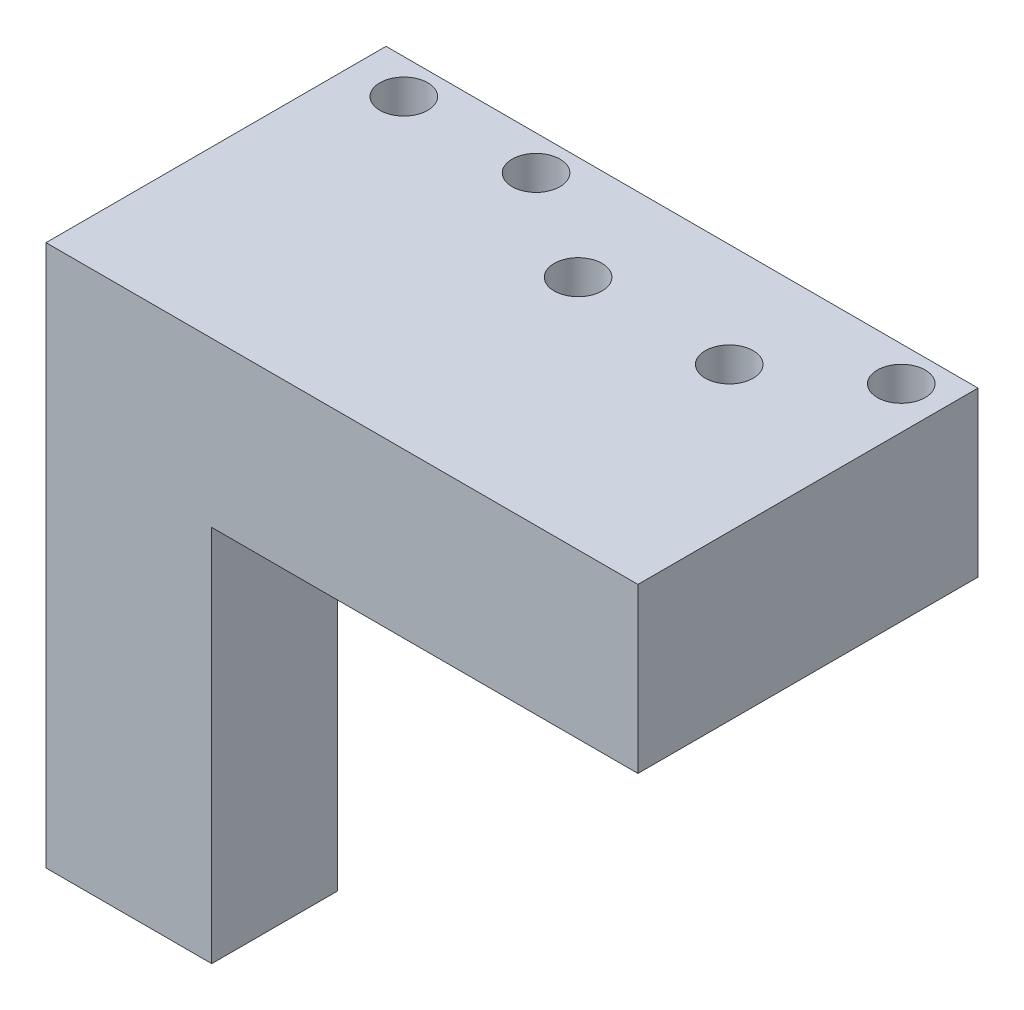
ISO-10303-21;
HEADER;
FILE_DESCRIPTION(('STEP AP214'),'2;1');
FILE_NAME('part.step','',(''),(''),'','','');
FILE_SCHEMA(('AUTOMOTIVE_DESIGN { 1 0 10303 214 1 1 1 1 }'));
ENDSEC;
DATA;
#1=APPLICATION_CONTEXT('core data for automotive mechanical design processes');
#2=APPLICATION_PROTOCOL_DEFINITION('international standard','automotive_design',2000,#1);
#3=PRODUCT_CONTEXT('',#1,'mechanical');
#4=PRODUCT('Part','Part','',(#3));
#5=PRODUCT_RELATED_PRODUCT_CATEGORY('part','',(#4));
#6=PRODUCT_DEFINITION_FORMATION('','',#4);
#7=PRODUCT_DEFINITION_CONTEXT('part definition',#1,'design');
#8=PRODUCT_DEFINITION('design','',#6,#7);
#9=PRODUCT_DEFINITION_SHAPE('','',#8);
#10=(LENGTH_UNIT() NAMED_UNIT(*) SI_UNIT(.MILLI.,.METRE.));
#11=(NAMED_UNIT(*) PLANE_ANGLE_UNIT() SI_UNIT($,.RADIAN.));
#12=(NAMED_UNIT(*) SI_UNIT($,.STERADIAN.) SOLID_ANGLE_UNIT());
#13=UNCERTAINTY_MEASURE_WITH_UNIT(LENGTH_MEASURE(1.E-05),#10,'distance_accuracy_value','');
#14=(GEOMETRIC_REPRESENTATION_CONTEXT(3) GLOBAL_UNCERTAINTY_ASSIGNED_CONTEXT((#13)) GLOBAL_UNIT_ASSIGNED_CONTEXT((#10,
#11,#12)) REPRESENTATION_CONTEXT('',''));
#15=CARTESIAN_POINT('',(0.,0.,0.));
#16=DIRECTION('',(0.,0.,1.));
#17=DIRECTION('',(1.,0.,0.));
#18=AXIS2_PLACEMENT_3D('',#15,#16,#17);
#19=CARTESIAN_POINT('',(0.,13.,0.));
#20=DIRECTION('',(0.,-1.,0.));
#21=DIRECTION('',(0.,0.,-1.));
#22=AXIS2_PLACEMENT_3D('',#19,#20,#21);
#23=PLANE('',#22);
#24=DIRECTION('',(0.,0.,-1.));
#25=VECTOR('',#24,1.);
#26=CARTESIAN_POINT('',(23.5,13.,21.5));
#27=LINE('',#26,#25);
#28=CARTESIAN_POINT('',(23.5,13.,21.5));
#29=VERTEX_POINT('',#28);
#30=CARTESIAN_POINT('',(23.5,13.,-5.5));
#31=VERTEX_POINT('',#30);
#32=EDGE_CURVE('E93',#29,#31,#27,.T.);
#33=ORIENTED_EDGE('',*,*,#32,.T.);
#34=DIRECTION('',(-1.,0.,0.));
#35=VECTOR('',#34,1.);
#36=CARTESIAN_POINT('',(-23.5,13.,-5.5));
#37=LINE('',#36,#35);
#38=CARTESIAN_POINT('',(-23.5,13.,-5.5));
#39=VERTEX_POINT('',#38);
#40=EDGE_CURVE('E196',#31,#39,#37,.T.);
#41=ORIENTED_EDGE('',*,*,#40,.T.);
#42=DIRECTION('',(0.,0.,1.));
#43=VECTOR('',#42,1.);
#44=CARTESIAN_POINT('',(-23.5,13.,-5.5));
#45=LINE('',#44,#43);
#46=CARTESIAN_POINT('',(-23.5,13.,21.5));
#47=VERTEX_POINT('',#46);
#48=EDGE_CURVE('E199',#39,#47,#45,.T.);
#49=ORIENTED_EDGE('',*,*,#48,.T.);
#50=DIRECTION('',(1.,0.,0.));
#51=VECTOR('',#50,1.);
#52=CARTESIAN_POINT('',(-23.5,13.,21.5));
#53=LINE('',#52,#51);
#54=EDGE_CURVE('E70',#47,#29,#53,.T.);
#55=ORIENTED_EDGE('',*,*,#54,.T.);
#56=EDGE_LOOP('',(#33,#41,#49,#55));
#57=FACE_BOUND('',#56,.T.);
#58=CARTESIAN_POINT('',(20.1592426173726,13.,-2.75000000000001));
#59=DIRECTION('',(0.,1.,0.));
#60=DIRECTION('',(0.,0.,1.));
#61=AXIS2_PLACEMENT_3D('',#58,#59,#60);
#62=CIRCLE('',#61,1.9);
#63=CARTESIAN_POINT('',(20.1592426173726,13.,-4.65000000000001));
#64=VERTEX_POINT('',#63);
#65=EDGE_CURVE('E186',#64,#64,#62,.T.);
#66=ORIENTED_EDGE('',*,*,#65,.F.);
#67=EDGE_LOOP('',(#66));
#68=FACE_BOUND('',#67,.T.);
#69=CARTESIAN_POINT('',(-8.84075738262738,13.,-2.75000000000001));
#70=DIRECTION('',(0.,1.,0.));
#71=DIRECTION('',(0.,0.,1.));
#72=AXIS2_PLACEMENT_3D('',#69,#70,#71);
#73=CIRCLE('',#72,1.9);
#74=CARTESIAN_POINT('',(-8.84075738262738,13.,-4.65000000000001));
#75=VERTEX_POINT('',#74);
#76=EDGE_CURVE('E178',#75,#75,#73,.T.);
#77=ORIENTED_EDGE('',*,*,#76,.F.);
#78=EDGE_LOOP('',(#77));
#79=FACE_BOUND('',#78,.T.);
#80=CARTESIAN_POINT('',(-19.3407573826274,13.,-2.75000000000001));
#81=DIRECTION('',(0.,1.,0.));
#82=DIRECTION('',(0.,0.,1.));
#83=AXIS2_PLACEMENT_3D('',#80,#81,#82);
#84=CIRCLE('',#83,1.9);
#85=CARTESIAN_POINT('',(-19.3407573826274,13.,-4.65000000000001));
#86=VERTEX_POINT('',#85);
#87=EDGE_CURVE('E171',#86,#86,#84,.T.);
#88=ORIENTED_EDGE('',*,*,#87,.F.);
#89=EDGE_LOOP('',(#88));
#90=FACE_BOUND('',#89,.T.);
#91=CARTESIAN_POINT('',(0.,13.,2.75));
#92=DIRECTION('',(0.,1.,0.));
#93=DIRECTION('',(0.,0.,1.));
#94=AXIS2_PLACEMENT_3D('',#91,#92,#93);
#95=CIRCLE('',#94,1.9);
#96=CARTESIAN_POINT('',(0.,13.,0.85));
#97=VERTEX_POINT('',#96);
#98=EDGE_CURVE('E163',#97,#97,#95,.T.);
#99=ORIENTED_EDGE('',*,*,#98,.F.);
#100=EDGE_LOOP('',(#99));
#101=FACE_BOUND('',#100,.T.);
#102=CARTESIAN_POINT('',(12.,13.,2.75));
#103=DIRECTION('',(0.,1.,0.));
#104=DIRECTION('',(0.,0.,1.));
#105=AXIS2_PLACEMENT_3D('',#102,#103,#104);
#106=CIRCLE('',#105,1.9);
#107=CARTESIAN_POINT('',(12.,13.,0.85));
#108=VERTEX_POINT('',#107);
#109=EDGE_CURVE('E155',#108,#108,#106,.T.);
#110=ORIENTED_EDGE('',*,*,#109,.F.);
#111=EDGE_LOOP('',(#110));
#112=FACE_BOUND('',#111,.T.);
#113=ADVANCED_FACE('F45',(#57,#68,#79,#90,#101,#112),#23,.F.);
#114=CARTESIAN_POINT('',(0.,0.,0.));
#115=DIRECTION('',(0.,-1.,0.));
#116=DIRECTION('',(0.,0.,-1.));
#117=AXIS2_PLACEMENT_3D('',#114,#115,#116);
#118=PLANE('',#117);
#119=DIRECTION('',(0.,0.,1.));
#120=VECTOR('',#119,1.);
#121=CARTESIAN_POINT('',(-10.3407573826274,0.,11.5));
#122=LINE('',#121,#120);
#123=CARTESIAN_POINT('',(-10.3407573826274,0.,11.5));
#124=VERTEX_POINT('',#123);
#125=CARTESIAN_POINT('',(-10.3407573826274,0.,21.5));
#126=VERTEX_POINT('',#125);
#127=EDGE_CURVE('E149',#124,#126,#122,.T.);
#128=ORIENTED_EDGE('',*,*,#127,.F.);
#129=DIRECTION('',(-1.,0.,0.));
#130=VECTOR('',#129,1.);
#131=CARTESIAN_POINT('',(-23.5,0.,11.5));
#132=LINE('',#131,#130);
#133=CARTESIAN_POINT('',(-23.5,0.,11.5));
#134=VERTEX_POINT('',#133);
#135=EDGE_CURVE('E136',#124,#134,#132,.T.);
#136=ORIENTED_EDGE('',*,*,#135,.T.);
#137=DIRECTION('',(0.,0.,1.));
#138=VECTOR('',#137,1.);
#139=CARTESIAN_POINT('',(-23.5,0.,5.5));
#140=LINE('',#139,#138);
#141=CARTESIAN_POINT('',(-23.5,0.,-5.5));
#142=VERTEX_POINT('',#141);
#143=EDGE_CURVE('E134',#142,#134,#140,.T.);
#144=ORIENTED_EDGE('',*,*,#143,.F.);
#145=DIRECTION('',(-1.,0.,0.));
#146=VECTOR('',#145,1.);
#147=CARTESIAN_POINT('',(-23.5,0.,-5.5));
#148=LINE('',#147,#146);
#149=CARTESIAN_POINT('',(23.5,0.,-5.5));
#150=VERTEX_POINT('',#149);
#151=EDGE_CURVE('E207',#150,#142,#148,.T.);
#152=ORIENTED_EDGE('',*,*,#151,.F.);
#153=DIRECTION('',(0.,0.,-1.));
#154=VECTOR('',#153,1.);
#155=CARTESIAN_POINT('',(23.5,0.,-5.5));
#156=LINE('',#155,#154);
#157=CARTESIAN_POINT('',(23.5,0.,21.5));
#158=VERTEX_POINT('',#157);
#159=EDGE_CURVE('E190',#158,#150,#156,.T.);
#160=ORIENTED_EDGE('',*,*,#159,.F.);
#161=DIRECTION('',(1.,0.,0.));
#162=VECTOR('',#161,1.);
#163=CARTESIAN_POINT('',(-23.5,0.,21.5));
#164=LINE('',#163,#162);
#165=EDGE_CURVE('E88',#126,#158,#164,.T.);
#166=ORIENTED_EDGE('',*,*,#165,.F.);
#167=EDGE_LOOP('',(#128,#136,#144,#152,#160,#166));
#168=FACE_BOUND('',#167,.T.);
#169=CARTESIAN_POINT('',(0.,0.,2.75));
#170=DIRECTION('',(0.,1.,0.));
#171=DIRECTION('',(0.,0.,1.));
#172=AXIS2_PLACEMENT_3D('',#169,#170,#171);
#173=CIRCLE('',#172,1.9);
#174=CARTESIAN_POINT('',(0.,0.,0.85));
#175=VERTEX_POINT('',#174);
#176=EDGE_CURVE('E159',#175,#175,#173,.T.);
#177=ORIENTED_EDGE('',*,*,#176,.T.);
#178=EDGE_LOOP('',(#177));
#179=FACE_BOUND('',#178,.T.);
#180=CARTESIAN_POINT('',(-8.84075738262738,0.,-2.75000000000001));
#181=DIRECTION('',(0.,1.,0.));
#182=DIRECTION('',(0.,0.,1.));
#183=AXIS2_PLACEMENT_3D('',#180,#181,#182);
#184=CIRCLE('',#183,1.9);
#185=CARTESIAN_POINT('',(-8.84075738262738,0.,-4.65000000000001));
#186=VERTEX_POINT('',#185);
#187=EDGE_CURVE('E175',#186,#186,#184,.T.);
#188=ORIENTED_EDGE('',*,*,#187,.T.);
#189=EDGE_LOOP('',(#188));
#190=FACE_BOUND('',#189,.T.);
#191=CARTESIAN_POINT('',(20.1592426173726,0.,-2.75000000000001));
#192=DIRECTION('',(0.,1.,0.));
#193=DIRECTION('',(0.,0.,1.));
#194=AXIS2_PLACEMENT_3D('',#191,#192,#193);
#195=CIRCLE('',#194,1.9);
#196=CARTESIAN_POINT('',(20.1592426173726,0.,-4.65000000000001));
#197=VERTEX_POINT('',#196);
#198=EDGE_CURVE('E182',#197,#197,#195,.T.);
#199=ORIENTED_EDGE('',*,*,#198,.T.);
#200=EDGE_LOOP('',(#199));
#201=FACE_BOUND('',#200,.T.);
#202=CARTESIAN_POINT('',(-19.3407573826274,0.,-2.75000000000001));
#203=DIRECTION('',(0.,1.,0.));
#204=DIRECTION('',(0.,0.,1.));
#205=AXIS2_PLACEMENT_3D('',#202,#203,#204);
#206=CIRCLE('',#205,1.9);
#207=CARTESIAN_POINT('',(-19.3407573826274,0.,-4.65000000000001));
#208=VERTEX_POINT('',#207);
#209=EDGE_CURVE('E167',#208,#208,#206,.T.);
#210=ORIENTED_EDGE('',*,*,#209,.T.);
#211=EDGE_LOOP('',(#210));
#212=FACE_BOUND('',#211,.T.);
#213=CARTESIAN_POINT('',(12.,0.,2.75));
#214=DIRECTION('',(0.,1.,0.));
#215=DIRECTION('',(0.,0.,1.));
#216=AXIS2_PLACEMENT_3D('',#213,#214,#215);
#217=CIRCLE('',#216,1.9);
#218=CARTESIAN_POINT('',(12.,0.,0.85));
#219=VERTEX_POINT('',#218);
#220=EDGE_CURVE('E152',#219,#219,#217,.T.);
#221=ORIENTED_EDGE('',*,*,#220,.T.);
#222=EDGE_LOOP('',(#221));
#223=FACE_BOUND('',#222,.T.);
#224=ADVANCED_FACE('F229',(#168,#179,#190,#201,#212,#223),#118,.T.);
#225=CARTESIAN_POINT('',(23.5,13.,-5.5));
#226=DIRECTION('',(-1.,0.,0.));
#227=DIRECTION('',(0.,0.,1.));
#228=AXIS2_PLACEMENT_3D('',#225,#226,#227);
#229=PLANE('',#228);
#230=ORIENTED_EDGE('',*,*,#159,.T.);
#231=DIRECTION('',(0.,-1.,0.));
#232=VECTOR('',#231,1.);
#233=CARTESIAN_POINT('',(23.5,13.,-5.5));
#234=LINE('',#233,#232);
#235=EDGE_CURVE('E11',#31,#150,#234,.T.);
#236=ORIENTED_EDGE('',*,*,#235,.F.);
#237=ORIENTED_EDGE('',*,*,#32,.F.);
#238=DIRECTION('',(0.,-1.,0.));
#239=VECTOR('',#238,1.);
#240=CARTESIAN_POINT('',(23.5,13.,21.5));
#241=LINE('',#240,#239);
#242=EDGE_CURVE('E204',#29,#158,#241,.T.);
#243=ORIENTED_EDGE('',*,*,#242,.T.);
#244=EDGE_LOOP('',(#230,#236,#237,#243));
#245=FACE_BOUND('',#244,.T.);
#246=ADVANCED_FACE('F47',(#245),#229,.F.);
#247=CARTESIAN_POINT('',(-23.5,13.,-5.5));
#248=DIRECTION('',(0.,0.,1.));
#249=DIRECTION('',(1.,0.,0.));
#250=AXIS2_PLACEMENT_3D('',#247,#248,#249);
#251=PLANE('',#250);
#252=ORIENTED_EDGE('',*,*,#151,.T.);
#253=DIRECTION('',(0.,-1.,0.));
#254=VECTOR('',#253,1.);
#255=CARTESIAN_POINT('',(-23.5,13.,-5.5));
#256=LINE('',#255,#254);
#257=EDGE_CURVE('E54',#39,#142,#256,.T.);
#258=ORIENTED_EDGE('',*,*,#257,.F.);
#259=ORIENTED_EDGE('',*,*,#40,.F.);
#260=ORIENTED_EDGE('',*,*,#235,.T.);
#261=EDGE_LOOP('',(#252,#258,#259,#260));
#262=FACE_BOUND('',#261,.T.);
#263=ADVANCED_FACE('F225',(#262),#251,.F.);
#264=CARTESIAN_POINT('',(-23.5,13.,5.5));
#265=DIRECTION('',(1.,0.,0.));
#266=DIRECTION('',(0.,0.,-1.));
#267=AXIS2_PLACEMENT_3D('',#264,#265,#266);
#268=PLANE('',#267);
#269=ORIENTED_EDGE('',*,*,#143,.T.);
#270=DIRECTION('',(0.,-1.,0.));
#271=VECTOR('',#270,1.);
#272=CARTESIAN_POINT('',(-23.5,0.,11.5));
#273=LINE('',#272,#271);
#274=CARTESIAN_POINT('',(-23.5,-30.,11.5));
#275=VERTEX_POINT('',#274);
#276=EDGE_CURVE('E61',#134,#275,#273,.T.);
#277=ORIENTED_EDGE('',*,*,#276,.T.);
#278=DIRECTION('',(0.,0.,1.));
#279=VECTOR('',#278,1.);
#280=CARTESIAN_POINT('',(-23.5,-30.,11.5));
#281=LINE('',#280,#279);
#282=CARTESIAN_POINT('',(-23.5,-30.,21.5));
#283=VERTEX_POINT('',#282);
#284=EDGE_CURVE('E115',#275,#283,#281,.T.);
#285=ORIENTED_EDGE('',*,*,#284,.T.);
#286=DIRECTION('',(0.,-1.,0.));
#287=VECTOR('',#286,1.);
#288=CARTESIAN_POINT('',(-23.5,13.,21.5));
#289=LINE('',#288,#287);
#290=EDGE_CURVE('E218',#47,#283,#289,.T.);
#291=ORIENTED_EDGE('',*,*,#290,.F.);
#292=ORIENTED_EDGE('',*,*,#48,.F.);
#293=ORIENTED_EDGE('',*,*,#257,.T.);
#294=EDGE_LOOP('',(#269,#277,#285,#291,#292,#293));
#295=FACE_BOUND('',#294,.T.);
#296=ADVANCED_FACE('F132',(#295),#268,.F.);
#297=CARTESIAN_POINT('',(-23.5,13.,21.5));
#298=DIRECTION('',(0.,0.,-1.));
#299=DIRECTION('',(-1.,0.,0.));
#300=AXIS2_PLACEMENT_3D('',#297,#298,#299);
#301=PLANE('',#300);
#302=ORIENTED_EDGE('',*,*,#290,.T.);
#303=DIRECTION('',(1.,0.,0.));
#304=VECTOR('',#303,1.);
#305=CARTESIAN_POINT('',(-23.5,-30.,21.5));
#306=LINE('',#305,#304);
#307=CARTESIAN_POINT('',(-10.3407573826274,-30.,21.5));
#308=VERTEX_POINT('',#307);
#309=EDGE_CURVE('E120',#283,#308,#306,.T.);
#310=ORIENTED_EDGE('',*,*,#309,.T.);
#311=DIRECTION('',(0.,1.,0.));
#312=VECTOR('',#311,1.);
#313=CARTESIAN_POINT('',(-10.3407573826274,0.,21.5));
#314=LINE('',#313,#312);
#315=EDGE_CURVE('E141',#308,#126,#314,.T.);
#316=ORIENTED_EDGE('',*,*,#315,.T.);
#317=ORIENTED_EDGE('',*,*,#165,.T.);
#318=ORIENTED_EDGE('',*,*,#242,.F.);
#319=ORIENTED_EDGE('',*,*,#54,.F.);
#320=EDGE_LOOP('',(#302,#310,#316,#317,#318,#319));
#321=FACE_BOUND('',#320,.T.);
#322=ADVANCED_FACE('F234',(#321),#301,.F.);
#323=CARTESIAN_POINT('',(20.1592426173726,13.,-2.75000000000001));
#324=DIRECTION('',(0.,-1.,0.));
#325=DIRECTION('',(0.,0.,-1.));
#326=AXIS2_PLACEMENT_3D('',#323,#324,#325);
#327=CYLINDRICAL_SURFACE('',#326,1.9);
#328=CARTESIAN_POINT('',(20.1592426173726,13.,-4.65000000000001));
#329=CARTESIAN_POINT('',(20.1592426173726,12.8645833333333,-4.65000000000001));
#330=CARTESIAN_POINT('',(20.1592426173726,12.7291666666667,-4.65000000000001));
#331=CARTESIAN_POINT('',(20.1592426173726,12.4583333333333,-4.65000000000001));
#332=CARTESIAN_POINT('',(20.1592426173726,12.3229166666667,-4.65000000000001));
#333=CARTESIAN_POINT('',(20.1592426173726,12.0520833333333,-4.65000000000001));
#334=CARTESIAN_POINT('',(20.1592426173726,11.9166666666667,-4.65000000000001));
#335=CARTESIAN_POINT('',(20.1592426173726,11.6458333333333,-4.65000000000001));
#336=CARTESIAN_POINT('',(20.1592426173726,11.5104166666667,-4.65000000000001));
#337=CARTESIAN_POINT('',(20.1592426173726,11.2395833333333,-4.65000000000001));
#338=CARTESIAN_POINT('',(20.1592426173726,11.1041666666667,-4.65000000000001));
#339=CARTESIAN_POINT('',(20.1592426173726,10.8333333333333,-4.65000000000001));
#340=CARTESIAN_POINT('',(20.1592426173726,10.6979166666667,-4.65000000000001));
#341=CARTESIAN_POINT('',(20.1592426173726,10.4270833333333,-4.65000000000001));
#342=CARTESIAN_POINT('',(20.1592426173726,10.2916666666667,-4.65000000000001));
#343=CARTESIAN_POINT('',(20.1592426173726,10.0208333333333,-4.65000000000001));
#344=CARTESIAN_POINT('',(20.1592426173726,9.88541666666667,-4.65000000000001));
#345=CARTESIAN_POINT('',(20.1592426173726,9.61458333333333,-4.65000000000001));
#346=CARTESIAN_POINT('',(20.1592426173726,9.47916666666667,-4.65000000000001));
#347=CARTESIAN_POINT('',(20.1592426173726,9.20833333333333,-4.65000000000001));
#348=CARTESIAN_POINT('',(20.1592426173726,9.07291666666666,-4.65000000000001));
#349=CARTESIAN_POINT('',(20.1592426173726,8.80208333333333,-4.65000000000001));
#350=CARTESIAN_POINT('',(20.1592426173726,8.66666666666667,-4.65000000000001));
#351=CARTESIAN_POINT('',(20.1592426173726,8.39583333333333,-4.65000000000001));
#352=CARTESIAN_POINT('',(20.1592426173726,8.26041666666667,-4.65000000000001));
#353=CARTESIAN_POINT('',(20.1592426173726,7.98958333333333,-4.65000000000001));
#354=CARTESIAN_POINT('',(20.1592426173726,7.85416666666667,-4.65000000000001));
#355=CARTESIAN_POINT('',(20.1592426173726,7.58333333333333,-4.65000000000001));
#356=CARTESIAN_POINT('',(20.1592426173726,7.44791666666667,-4.65000000000001));
#357=CARTESIAN_POINT('',(20.1592426173726,7.17708333333333,-4.65000000000001));
#358=CARTESIAN_POINT('',(20.1592426173726,7.04166666666667,-4.65000000000001));
#359=CARTESIAN_POINT('',(20.1592426173726,6.77083333333333,-4.65000000000001));
#360=CARTESIAN_POINT('',(20.1592426173726,6.63541666666667,-4.65000000000001));
#361=CARTESIAN_POINT('',(20.1592426173726,6.36458333333333,-4.65000000000001));
#362=CARTESIAN_POINT('',(20.1592426173726,6.22916666666667,-4.65000000000001));
#363=CARTESIAN_POINT('',(20.1592426173726,5.95833333333333,-4.65000000000001));
#364=CARTESIAN_POINT('',(20.1592426173726,5.82291666666667,-4.65000000000001));
#365=CARTESIAN_POINT('',(20.1592426173726,5.55208333333333,-4.65000000000001));
#366=CARTESIAN_POINT('',(20.1592426173726,5.41666666666667,-4.65000000000001));
#367=CARTESIAN_POINT('',(20.1592426173726,5.14583333333333,-4.65000000000001));
#368=CARTESIAN_POINT('',(20.1592426173726,5.01041666666667,-4.65000000000001));
#369=CARTESIAN_POINT('',(20.1592426173726,4.73958333333333,-4.65000000000001));
#370=CARTESIAN_POINT('',(20.1592426173726,4.60416666666667,-4.65000000000001));
#371=CARTESIAN_POINT('',(20.1592426173726,4.33333333333333,-4.65000000000001));
#372=CARTESIAN_POINT('',(20.1592426173726,4.19791666666667,-4.65000000000001));
#373=CARTESIAN_POINT('',(20.1592426173726,3.92708333333333,-4.65000000000001));
#374=CARTESIAN_POINT('',(20.1592426173726,3.79166666666667,-4.65000000000001));
#375=CARTESIAN_POINT('',(20.1592426173726,3.52083333333333,-4.65000000000001));
#376=CARTESIAN_POINT('',(20.1592426173726,3.38541666666667,-4.65000000000001));
#377=CARTESIAN_POINT('',(20.1592426173726,3.11458333333333,-4.65000000000001));
#378=CARTESIAN_POINT('',(20.1592426173726,2.97916666666667,-4.65000000000001));
#379=CARTESIAN_POINT('',(20.1592426173726,2.70833333333333,-4.65000000000001));
#380=CARTESIAN_POINT('',(20.1592426173726,2.57291666666667,-4.65000000000001));
#381=CARTESIAN_POINT('',(20.1592426173726,2.30208333333333,-4.65000000000001));
#382=CARTESIAN_POINT('',(20.1592426173726,2.16666666666667,-4.65000000000001));
#383=CARTESIAN_POINT('',(20.1592426173726,1.89583333333333,-4.65000000000001));
#384=CARTESIAN_POINT('',(20.1592426173726,1.76041666666667,-4.65000000000001));
#385=CARTESIAN_POINT('',(20.1592426173726,1.48958333333333,-4.65000000000001));
#386=CARTESIAN_POINT('',(20.1592426173726,1.35416666666667,-4.65000000000001));
#387=CARTESIAN_POINT('',(20.1592426173726,1.08333333333333,-4.65000000000001));
#388=CARTESIAN_POINT('',(20.1592426173726,0.947916666666667,-4.65000000000001));
#389=CARTESIAN_POINT('',(20.1592426173726,0.677083333333334,-4.65000000000001));
#390=CARTESIAN_POINT('',(20.1592426173726,0.541666666666667,-4.65000000000001));
#391=CARTESIAN_POINT('',(20.1592426173726,0.270833333333334,-4.65000000000001));
#392=CARTESIAN_POINT('',(20.1592426173726,0.135416666666667,-4.65000000000001));
#393=CARTESIAN_POINT('',(20.1592426173726,0.,-4.65000000000001));
#394=B_SPLINE_CURVE_WITH_KNOTS('',3,(#328,#329,#330,#331,#332,#333,#334,#335,#336,#337,#338,
#339,#340,#341,#342,#343,#344,#345,#346,#347,#348,#349,#350,#351,#352,#353,#354,#355,#356,#357,
#358,#359,#360,#361,#362,#363,#364,#365,#366,#367,#368,#369,#370,#371,#372,#373,#374,#375,#376,
#377,#378,#379,#380,#381,#382,#383,#384,#385,#386,#387,#388,#389,#390,#391,#392,#393),
.UNSPECIFIED.,.F.,.F.,(4,2,2,2,2,2,2,2,2,2,2,2,2,2,2,2,2,2,2,2,2,2,2,2,2,2,2,2,2,2,2,2,4),(0.,
0.40625,0.812500000000001,1.21875,1.625,2.03125,2.4375,2.84375,3.25,3.65625,4.0625,4.46875,
4.875,5.28125,5.6875,6.09375,6.5,6.90625,7.3125,7.71875,8.125,8.53125,8.9375,9.34375,9.75,
10.15625,10.5625,10.96875,11.375,11.78125,12.1875,12.59375,13.),.UNSPECIFIED.);
#395=EDGE_CURVE('BSEAM246',#64,#197,#394,.T.);
#396=ORIENTED_EDGE('',*,*,#65,.T.);
#397=ORIENTED_EDGE('',*,*,#198,.F.);
#398=ORIENTED_EDGE('',*,*,#395,.T.);
#399=ORIENTED_EDGE('',*,*,#395,.F.);
#400=EDGE_LOOP('',(#396,#398,#397,#399));
#401=FACE_BOUND('',#400,.T.);
#402=ADVANCED_FACE('F246',(#401),#327,.F.);
#403=CARTESIAN_POINT('',(-8.84075738262738,13.,-2.75000000000001));
#404=DIRECTION('',(0.,-1.,0.));
#405=DIRECTION('',(0.,0.,-1.));
#406=AXIS2_PLACEMENT_3D('',#403,#404,#405);
#407=CYLINDRICAL_SURFACE('',#406,1.9);
#408=CARTESIAN_POINT('',(-8.84075738262738,13.,-4.65000000000001));
#409=CARTESIAN_POINT('',(-8.84075738262738,12.8645833333333,-4.65000000000001));
#410=CARTESIAN_POINT('',(-8.84075738262738,12.7291666666667,-4.65000000000001));
#411=CARTESIAN_POINT('',(-8.84075738262738,12.4583333333333,-4.65000000000001));
#412=CARTESIAN_POINT('',(-8.84075738262738,12.3229166666667,-4.65000000000001));
#413=CARTESIAN_POINT('',(-8.84075738262738,12.0520833333333,-4.65000000000001));
#414=CARTESIAN_POINT('',(-8.84075738262738,11.9166666666667,-4.65000000000001));
#415=CARTESIAN_POINT('',(-8.84075738262738,11.6458333333333,-4.65000000000001));
#416=CARTESIAN_POINT('',(-8.84075738262738,11.5104166666667,-4.65000000000001));
#417=CARTESIAN_POINT('',(-8.84075738262738,11.2395833333333,-4.65000000000001));
#418=CARTESIAN_POINT('',(-8.84075738262738,11.1041666666667,-4.65000000000001));
#419=CARTESIAN_POINT('',(-8.84075738262738,10.8333333333333,-4.65000000000001));
#420=CARTESIAN_POINT('',(-8.84075738262738,10.6979166666667,-4.65000000000001));
#421=CARTESIAN_POINT('',(-8.84075738262738,10.4270833333333,-4.65000000000001));
#422=CARTESIAN_POINT('',(-8.84075738262738,10.2916666666667,-4.65000000000001));
#423=CARTESIAN_POINT('',(-8.84075738262738,10.0208333333333,-4.65000000000001));
#424=CARTESIAN_POINT('',(-8.84075738262738,9.88541666666667,-4.65000000000001));
#425=CARTESIAN_POINT('',(-8.84075738262738,9.61458333333333,-4.65000000000001));
#426=CARTESIAN_POINT('',(-8.84075738262738,9.47916666666667,-4.65000000000001));
#427=CARTESIAN_POINT('',(-8.84075738262738,9.20833333333333,-4.65000000000001));
#428=CARTESIAN_POINT('',(-8.84075738262738,9.07291666666666,-4.65000000000001));
#429=CARTESIAN_POINT('',(-8.84075738262738,8.80208333333333,-4.65000000000001));
#430=CARTESIAN_POINT('',(-8.84075738262738,8.66666666666667,-4.65000000000001));
#431=CARTESIAN_POINT('',(-8.84075738262738,8.39583333333333,-4.65000000000001));
#432=CARTESIAN_POINT('',(-8.84075738262738,8.26041666666667,-4.65000000000001));
#433=CARTESIAN_POINT('',(-8.84075738262738,7.98958333333333,-4.65000000000001));
#434=CARTESIAN_POINT('',(-8.84075738262738,7.85416666666667,-4.65000000000001));
#435=CARTESIAN_POINT('',(-8.84075738262738,7.58333333333333,-4.65000000000001));
#436=CARTESIAN_POINT('',(-8.84075738262738,7.44791666666667,-4.65000000000001));
#437=CARTESIAN_POINT('',(-8.84075738262738,7.17708333333333,-4.65000000000001));
#438=CARTESIAN_POINT('',(-8.84075738262738,7.04166666666667,-4.65000000000001));
#439=CARTESIAN_POINT('',(-8.84075738262738,6.77083333333333,-4.65000000000001));
#440=CARTESIAN_POINT('',(-8.84075738262738,6.63541666666667,-4.65000000000001));
#441=CARTESIAN_POINT('',(-8.84075738262738,6.36458333333333,-4.65000000000001));
#442=CARTESIAN_POINT('',(-8.84075738262738,6.22916666666667,-4.65000000000001));
#443=CARTESIAN_POINT('',(-8.84075738262738,5.95833333333333,-4.65000000000001));
#444=CARTESIAN_POINT('',(-8.84075738262738,5.82291666666667,-4.65000000000001));
#445=CARTESIAN_POINT('',(-8.84075738262738,5.55208333333333,-4.65000000000001));
#446=CARTESIAN_POINT('',(-8.84075738262738,5.41666666666667,-4.65000000000001));
#447=CARTESIAN_POINT('',(-8.84075738262738,5.14583333333333,-4.65000000000001));
#448=CARTESIAN_POINT('',(-8.84075738262738,5.01041666666667,-4.65000000000001));
#449=CARTESIAN_POINT('',(-8.84075738262738,4.73958333333333,-4.65000000000001));
#450=CARTESIAN_POINT('',(-8.84075738262738,4.60416666666667,-4.65000000000001));
#451=CARTESIAN_POINT('',(-8.84075738262738,4.33333333333333,-4.65000000000001));
#452=CARTESIAN_POINT('',(-8.84075738262738,4.19791666666667,-4.65000000000001));
#453=CARTESIAN_POINT('',(-8.84075738262738,3.92708333333333,-4.65000000000001));
#454=CARTESIAN_POINT('',(-8.84075738262738,3.79166666666667,-4.65000000000001));
#455=CARTESIAN_POINT('',(-8.84075738262738,3.52083333333333,-4.65000000000001));
#456=CARTESIAN_POINT('',(-8.84075738262738,3.38541666666667,-4.65000000000001));
#457=CARTESIAN_POINT('',(-8.84075738262738,3.11458333333333,-4.65000000000001));
#458=CARTESIAN_POINT('',(-8.84075738262738,2.97916666666667,-4.65000000000001));
#459=CARTESIAN_POINT('',(-8.84075738262738,2.70833333333333,-4.65000000000001));
#460=CARTESIAN_POINT('',(-8.84075738262738,2.57291666666667,-4.65000000000001));
#461=CARTESIAN_POINT('',(-8.84075738262738,2.30208333333333,-4.65000000000001));
#462=CARTESIAN_POINT('',(-8.84075738262738,2.16666666666667,-4.65000000000001));
#463=CARTESIAN_POINT('',(-8.84075738262738,1.89583333333333,-4.65000000000001));
#464=CARTESIAN_POINT('',(-8.84075738262738,1.76041666666667,-4.65000000000001));
#465=CARTESIAN_POINT('',(-8.84075738262738,1.48958333333333,-4.65000000000001));
#466=CARTESIAN_POINT('',(-8.84075738262738,1.35416666666667,-4.65000000000001));
#467=CARTESIAN_POINT('',(-8.84075738262738,1.08333333333333,-4.65000000000001));
#468=CARTESIAN_POINT('',(-8.84075738262738,0.947916666666667,-4.65000000000001));
#469=CARTESIAN_POINT('',(-8.84075738262738,0.677083333333334,-4.65000000000001));
#470=CARTESIAN_POINT('',(-8.84075738262738,0.541666666666667,-4.65000000000001));
#471=CARTESIAN_POINT('',(-8.84075738262738,0.270833333333334,-4.65000000000001));
#472=CARTESIAN_POINT('',(-8.84075738262738,0.135416666666667,-4.65000000000001));
#473=CARTESIAN_POINT('',(-8.84075738262738,0.,-4.65000000000001));
#474=B_SPLINE_CURVE_WITH_KNOTS('',3,(#408,#409,#410,#411,#412,#413,#414,#415,#416,#417,#418,
#419,#420,#421,#422,#423,#424,#425,#426,#427,#428,#429,#430,#431,#432,#433,#434,#435,#436,#437,
#438,#439,#440,#441,#442,#443,#444,#445,#446,#447,#448,#449,#450,#451,#452,#453,#454,#455,#456,
#457,#458,#459,#460,#461,#462,#463,#464,#465,#466,#467,#468,#469,#470,#471,#472,#473),
.UNSPECIFIED.,.F.,.F.,(4,2,2,2,2,2,2,2,2,2,2,2,2,2,2,2,2,2,2,2,2,2,2,2,2,2,2,2,2,2,2,2,4),(0.,
0.40625,0.812500000000001,1.21875,1.625,2.03125,2.4375,2.84375,3.25,3.65625,4.0625,4.46875,
4.875,5.28125,5.6875,6.09375,6.5,6.90625,7.3125,7.71875,8.125,8.53125,8.9375,9.34375,9.75,
10.15625,10.5625,10.96875,11.375,11.78125,12.1875,12.59375,13.),.UNSPECIFIED.);
#475=EDGE_CURVE('BSEAM264',#75,#186,#474,.T.);
#476=ORIENTED_EDGE('',*,*,#76,.T.);
#477=ORIENTED_EDGE('',*,*,#187,.F.);
#478=ORIENTED_EDGE('',*,*,#475,.T.);
#479=ORIENTED_EDGE('',*,*,#475,.F.);
#480=EDGE_LOOP('',(#476,#478,#477,#479));
#481=FACE_BOUND('',#480,.T.);
#482=ADVANCED_FACE('F264',(#481),#407,.F.);
#483=CARTESIAN_POINT('',(-19.3407573826274,13.,-2.75000000000001));
#484=DIRECTION('',(0.,-1.,0.));
#485=DIRECTION('',(0.,0.,-1.));
#486=AXIS2_PLACEMENT_3D('',#483,#484,#485);
#487=CYLINDRICAL_SURFACE('',#486,1.9);
#488=CARTESIAN_POINT('',(-19.3407573826274,13.,-4.65000000000001));
#489=CARTESIAN_POINT('',(-19.3407573826274,12.8645833333333,-4.65000000000001));
#490=CARTESIAN_POINT('',(-19.3407573826274,12.7291666666667,-4.65000000000001));
#491=CARTESIAN_POINT('',(-19.3407573826274,12.4583333333333,-4.65000000000001));
#492=CARTESIAN_POINT('',(-19.3407573826274,12.3229166666667,-4.65000000000001));
#493=CARTESIAN_POINT('',(-19.3407573826274,12.0520833333333,-4.65000000000001));
#494=CARTESIAN_POINT('',(-19.3407573826274,11.9166666666667,-4.65000000000001));
#495=CARTESIAN_POINT('',(-19.3407573826274,11.6458333333333,-4.65000000000001));
#496=CARTESIAN_POINT('',(-19.3407573826274,11.5104166666667,-4.65000000000001));
#497=CARTESIAN_POINT('',(-19.3407573826274,11.2395833333333,-4.65000000000001));
#498=CARTESIAN_POINT('',(-19.3407573826274,11.1041666666667,-4.65000000000001));
#499=CARTESIAN_POINT('',(-19.3407573826274,10.8333333333333,-4.65000000000001));
#500=CARTESIAN_POINT('',(-19.3407573826274,10.6979166666667,-4.65000000000001));
#501=CARTESIAN_POINT('',(-19.3407573826274,10.4270833333333,-4.65000000000001));
#502=CARTESIAN_POINT('',(-19.3407573826274,10.2916666666667,-4.65000000000001));
#503=CARTESIAN_POINT('',(-19.3407573826274,10.0208333333333,-4.65000000000001));
#504=CARTESIAN_POINT('',(-19.3407573826274,9.88541666666667,-4.65000000000001));
#505=CARTESIAN_POINT('',(-19.3407573826274,9.61458333333333,-4.65000000000001));
#506=CARTESIAN_POINT('',(-19.3407573826274,9.47916666666667,-4.65000000000001));
#507=CARTESIAN_POINT('',(-19.3407573826274,9.20833333333333,-4.65000000000001));
#508=CARTESIAN_POINT('',(-19.3407573826274,9.07291666666666,-4.65000000000001));
#509=CARTESIAN_POINT('',(-19.3407573826274,8.80208333333333,-4.65000000000001));
#510=CARTESIAN_POINT('',(-19.3407573826274,8.66666666666667,-4.65000000000001));
#511=CARTESIAN_POINT('',(-19.3407573826274,8.39583333333333,-4.65000000000001));
#512=CARTESIAN_POINT('',(-19.3407573826274,8.26041666666667,-4.65000000000001));
#513=CARTESIAN_POINT('',(-19.3407573826274,7.98958333333333,-4.65000000000001));
#514=CARTESIAN_POINT('',(-19.3407573826274,7.85416666666667,-4.65000000000001));
#515=CARTESIAN_POINT('',(-19.3407573826274,7.58333333333333,-4.65000000000001));
#516=CARTESIAN_POINT('',(-19.3407573826274,7.44791666666667,-4.65000000000001));
#517=CARTESIAN_POINT('',(-19.3407573826274,7.17708333333333,-4.65000000000001));
#518=CARTESIAN_POINT('',(-19.3407573826274,7.04166666666667,-4.65000000000001));
#519=CARTESIAN_POINT('',(-19.3407573826274,6.77083333333333,-4.65000000000001));
#520=CARTESIAN_POINT('',(-19.3407573826274,6.63541666666667,-4.65000000000001));
#521=CARTESIAN_POINT('',(-19.3407573826274,6.36458333333333,-4.65000000000001));
#522=CARTESIAN_POINT('',(-19.3407573826274,6.22916666666667,-4.65000000000001));
#523=CARTESIAN_POINT('',(-19.3407573826274,5.95833333333333,-4.65000000000001));
#524=CARTESIAN_POINT('',(-19.3407573826274,5.82291666666667,-4.65000000000001));
#525=CARTESIAN_POINT('',(-19.3407573826274,5.55208333333333,-4.65000000000001));
#526=CARTESIAN_POINT('',(-19.3407573826274,5.41666666666667,-4.65000000000001));
#527=CARTESIAN_POINT('',(-19.3407573826274,5.14583333333333,-4.65000000000001));
#528=CARTESIAN_POINT('',(-19.3407573826274,5.01041666666667,-4.65000000000001));
#529=CARTESIAN_POINT('',(-19.3407573826274,4.73958333333333,-4.65000000000001));
#530=CARTESIAN_POINT('',(-19.3407573826274,4.60416666666667,-4.65000000000001));
#531=CARTESIAN_POINT('',(-19.3407573826274,4.33333333333333,-4.65000000000001));
#532=CARTESIAN_POINT('',(-19.3407573826274,4.19791666666667,-4.65000000000001));
#533=CARTESIAN_POINT('',(-19.3407573826274,3.92708333333333,-4.65000000000001));
#534=CARTESIAN_POINT('',(-19.3407573826274,3.79166666666667,-4.65000000000001));
#535=CARTESIAN_POINT('',(-19.3407573826274,3.52083333333333,-4.65000000000001));
#536=CARTESIAN_POINT('',(-19.3407573826274,3.38541666666667,-4.65000000000001));
#537=CARTESIAN_POINT('',(-19.3407573826274,3.11458333333333,-4.65000000000001));
#538=CARTESIAN_POINT('',(-19.3407573826274,2.97916666666667,-4.65000000000001));
#539=CARTESIAN_POINT('',(-19.3407573826274,2.70833333333333,-4.65000000000001));
#540=CARTESIAN_POINT('',(-19.3407573826274,2.57291666666667,-4.65000000000001));
#541=CARTESIAN_POINT('',(-19.3407573826274,2.30208333333333,-4.65000000000001));
#542=CARTESIAN_POINT('',(-19.3407573826274,2.16666666666667,-4.65000000000001));
#543=CARTESIAN_POINT('',(-19.3407573826274,1.89583333333333,-4.65000000000001));
#544=CARTESIAN_POINT('',(-19.3407573826274,1.76041666666667,-4.65000000000001));
#545=CARTESIAN_POINT('',(-19.3407573826274,1.48958333333333,-4.65000000000001));
#546=CARTESIAN_POINT('',(-19.3407573826274,1.35416666666667,-4.65000000000001));
#547=CARTESIAN_POINT('',(-19.3407573826274,1.08333333333333,-4.65000000000001));
#548=CARTESIAN_POINT('',(-19.3407573826274,0.947916666666667,-4.65000000000001));
#549=CARTESIAN_POINT('',(-19.3407573826274,0.677083333333334,-4.65000000000001));
#550=CARTESIAN_POINT('',(-19.3407573826274,0.541666666666667,-4.65000000000001));
#551=CARTESIAN_POINT('',(-19.3407573826274,0.270833333333334,-4.65000000000001));
#552=CARTESIAN_POINT('',(-19.3407573826274,0.135416666666667,-4.65000000000001));
#553=CARTESIAN_POINT('',(-19.3407573826274,0.,-4.65000000000001));
#554=B_SPLINE_CURVE_WITH_KNOTS('',3,(#488,#489,#490,#491,#492,#493,#494,#495,#496,#497,#498,
#499,#500,#501,#502,#503,#504,#505,#506,#507,#508,#509,#510,#511,#512,#513,#514,#515,#516,#517,
#518,#519,#520,#521,#522,#523,#524,#525,#526,#527,#528,#529,#530,#531,#532,#533,#534,#535,#536,
#537,#538,#539,#540,#541,#542,#543,#544,#545,#546,#547,#548,#549,#550,#551,#552,#553),
.UNSPECIFIED.,.F.,.F.,(4,2,2,2,2,2,2,2,2,2,2,2,2,2,2,2,2,2,2,2,2,2,2,2,2,2,2,2,2,2,2,2,4),(0.,
0.40625,0.812500000000001,1.21875,1.625,2.03125,2.4375,2.84375,3.25,3.65625,4.0625,4.46875,
4.875,5.28125,5.6875,6.09375,6.5,6.90625,7.3125,7.71875,8.125,8.53125,8.9375,9.34375,9.75,
10.15625,10.5625,10.96875,11.375,11.78125,12.1875,12.59375,13.),.UNSPECIFIED.);
#555=EDGE_CURVE('BSEAM270',#86,#208,#554,.T.);
#556=ORIENTED_EDGE('',*,*,#87,.T.);
#557=ORIENTED_EDGE('',*,*,#209,.F.);
#558=ORIENTED_EDGE('',*,*,#555,.T.);
#559=ORIENTED_EDGE('',*,*,#555,.F.);
#560=EDGE_LOOP('',(#556,#558,#557,#559));
#561=FACE_BOUND('',#560,.T.);
#562=ADVANCED_FACE('F270',(#561),#487,.F.);
#563=CARTESIAN_POINT('',(0.,13.,2.75));
#564=DIRECTION('',(0.,-1.,0.));
#565=DIRECTION('',(0.,0.,-1.));
#566=AXIS2_PLACEMENT_3D('',#563,#564,#565);
#567=CYLINDRICAL_SURFACE('',#566,1.9);
#568=CARTESIAN_POINT('',(0.,13.,0.85));
#569=CARTESIAN_POINT('',(0.,12.8645833333333,0.85));
#570=CARTESIAN_POINT('',(0.,12.7291666666667,0.85));
#571=CARTESIAN_POINT('',(0.,12.4583333333333,0.85));
#572=CARTESIAN_POINT('',(0.,12.3229166666667,0.85));
#573=CARTESIAN_POINT('',(0.,12.0520833333333,0.85));
#574=CARTESIAN_POINT('',(0.,11.9166666666667,0.85));
#575=CARTESIAN_POINT('',(0.,11.6458333333333,0.85));
#576=CARTESIAN_POINT('',(0.,11.5104166666667,0.85));
#577=CARTESIAN_POINT('',(0.,11.2395833333333,0.85));
#578=CARTESIAN_POINT('',(0.,11.1041666666667,0.85));
#579=CARTESIAN_POINT('',(0.,10.8333333333333,0.85));
#580=CARTESIAN_POINT('',(0.,10.6979166666667,0.85));
#581=CARTESIAN_POINT('',(0.,10.4270833333333,0.85));
#582=CARTESIAN_POINT('',(0.,10.2916666666667,0.85));
#583=CARTESIAN_POINT('',(0.,10.0208333333333,0.85));
#584=CARTESIAN_POINT('',(0.,9.88541666666667,0.85));
#585=CARTESIAN_POINT('',(0.,9.61458333333333,0.85));
#586=CARTESIAN_POINT('',(0.,9.47916666666667,0.85));
#587=CARTESIAN_POINT('',(0.,9.20833333333333,0.85));
#588=CARTESIAN_POINT('',(0.,9.07291666666666,0.85));
#589=CARTESIAN_POINT('',(0.,8.80208333333333,0.85));
#590=CARTESIAN_POINT('',(0.,8.66666666666667,0.85));
#591=CARTESIAN_POINT('',(0.,8.39583333333333,0.85));
#592=CARTESIAN_POINT('',(0.,8.26041666666667,0.85));
#593=CARTESIAN_POINT('',(0.,7.98958333333333,0.85));
#594=CARTESIAN_POINT('',(0.,7.85416666666667,0.85));
#595=CARTESIAN_POINT('',(0.,7.58333333333333,0.85));
#596=CARTESIAN_POINT('',(0.,7.44791666666667,0.85));
#597=CARTESIAN_POINT('',(0.,7.17708333333333,0.85));
#598=CARTESIAN_POINT('',(0.,7.04166666666667,0.85));
#599=CARTESIAN_POINT('',(0.,6.77083333333333,0.85));
#600=CARTESIAN_POINT('',(0.,6.63541666666667,0.85));
#601=CARTESIAN_POINT('',(0.,6.36458333333333,0.85));
#602=CARTESIAN_POINT('',(0.,6.22916666666667,0.85));
#603=CARTESIAN_POINT('',(0.,5.95833333333333,0.85));
#604=CARTESIAN_POINT('',(0.,5.82291666666667,0.85));
#605=CARTESIAN_POINT('',(0.,5.55208333333333,0.85));
#606=CARTESIAN_POINT('',(0.,5.41666666666667,0.85));
#607=CARTESIAN_POINT('',(0.,5.14583333333333,0.85));
#608=CARTESIAN_POINT('',(0.,5.01041666666667,0.85));
#609=CARTESIAN_POINT('',(0.,4.73958333333333,0.85));
#610=CARTESIAN_POINT('',(0.,4.60416666666667,0.85));
#611=CARTESIAN_POINT('',(0.,4.33333333333333,0.85));
#612=CARTESIAN_POINT('',(0.,4.19791666666667,0.85));
#613=CARTESIAN_POINT('',(0.,3.92708333333333,0.85));
#614=CARTESIAN_POINT('',(0.,3.79166666666667,0.85));
#615=CARTESIAN_POINT('',(0.,3.52083333333333,0.85));
#616=CARTESIAN_POINT('',(0.,3.38541666666667,0.85));
#617=CARTESIAN_POINT('',(0.,3.11458333333333,0.85));
#618=CARTESIAN_POINT('',(0.,2.97916666666667,0.85));
#619=CARTESIAN_POINT('',(0.,2.70833333333333,0.85));
#620=CARTESIAN_POINT('',(0.,2.57291666666667,0.85));
#621=CARTESIAN_POINT('',(0.,2.30208333333333,0.85));
#622=CARTESIAN_POINT('',(0.,2.16666666666667,0.85));
#623=CARTESIAN_POINT('',(0.,1.89583333333333,0.85));
#624=CARTESIAN_POINT('',(0.,1.76041666666667,0.85));
#625=CARTESIAN_POINT('',(0.,1.48958333333333,0.85));
#626=CARTESIAN_POINT('',(0.,1.35416666666667,0.85));
#627=CARTESIAN_POINT('',(0.,1.08333333333333,0.85));
#628=CARTESIAN_POINT('',(0.,0.947916666666667,0.85));
#629=CARTESIAN_POINT('',(0.,0.677083333333334,0.85));
#630=CARTESIAN_POINT('',(0.,0.541666666666667,0.85));
#631=CARTESIAN_POINT('',(0.,0.270833333333334,0.85));
#632=CARTESIAN_POINT('',(0.,0.135416666666667,0.85));
#633=CARTESIAN_POINT('',(0.,0.,0.85));
#634=B_SPLINE_CURVE_WITH_KNOTS('',3,(#568,#569,#570,#571,#572,#573,#574,#575,#576,#577,#578,
#579,#580,#581,#582,#583,#584,#585,#586,#587,#588,#589,#590,#591,#592,#593,#594,#595,#596,#597,
#598,#599,#600,#601,#602,#603,#604,#605,#606,#607,#608,#609,#610,#611,#612,#613,#614,#615,#616,
#617,#618,#619,#620,#621,#622,#623,#624,#625,#626,#627,#628,#629,#630,#631,#632,#633),
.UNSPECIFIED.,.F.,.F.,(4,2,2,2,2,2,2,2,2,2,2,2,2,2,2,2,2,2,2,2,2,2,2,2,2,2,2,2,2,2,2,2,4),(0.,
0.40625,0.812500000000001,1.21875,1.625,2.03125,2.4375,2.84375,3.25,3.65625,4.0625,4.46875,
4.875,5.28125,5.6875,6.09375,6.5,6.90625,7.3125,7.71875,8.125,8.53125,8.9375,9.34375,9.75,
10.15625,10.5625,10.96875,11.375,11.78125,12.1875,12.59375,13.),.UNSPECIFIED.);
#635=EDGE_CURVE('BSEAM276',#97,#175,#634,.T.);
#636=ORIENTED_EDGE('',*,*,#98,.T.);
#637=ORIENTED_EDGE('',*,*,#176,.F.);
#638=ORIENTED_EDGE('',*,*,#635,.T.);
#639=ORIENTED_EDGE('',*,*,#635,.F.);
#640=EDGE_LOOP('',(#636,#638,#637,#639));
#641=FACE_BOUND('',#640,.T.);
#642=ADVANCED_FACE('F276',(#641),#567,.F.);
#643=CARTESIAN_POINT('',(12.,13.,2.75));
#644=DIRECTION('',(0.,-1.,0.));
#645=DIRECTION('',(0.,0.,-1.));
#646=AXIS2_PLACEMENT_3D('',#643,#644,#645);
#647=CYLINDRICAL_SURFACE('',#646,1.9);
#648=CARTESIAN_POINT('',(12.,13.,0.85));
#649=CARTESIAN_POINT('',(12.,12.8645833333333,0.85));
#650=CARTESIAN_POINT('',(12.,12.7291666666667,0.85));
#651=CARTESIAN_POINT('',(12.,12.4583333333333,0.85));
#652=CARTESIAN_POINT('',(12.,12.3229166666667,0.85));
#653=CARTESIAN_POINT('',(12.,12.0520833333333,0.85));
#654=CARTESIAN_POINT('',(12.,11.9166666666667,0.85));
#655=CARTESIAN_POINT('',(12.,11.6458333333333,0.85));
#656=CARTESIAN_POINT('',(12.,11.5104166666667,0.85));
#657=CARTESIAN_POINT('',(12.,11.2395833333333,0.85));
#658=CARTESIAN_POINT('',(12.,11.1041666666667,0.85));
#659=CARTESIAN_POINT('',(12.,10.8333333333333,0.85));
#660=CARTESIAN_POINT('',(12.,10.6979166666667,0.85));
#661=CARTESIAN_POINT('',(12.,10.4270833333333,0.85));
#662=CARTESIAN_POINT('',(12.,10.2916666666667,0.85));
#663=CARTESIAN_POINT('',(12.,10.0208333333333,0.85));
#664=CARTESIAN_POINT('',(12.,9.88541666666667,0.85));
#665=CARTESIAN_POINT('',(12.,9.61458333333333,0.85));
#666=CARTESIAN_POINT('',(12.,9.47916666666667,0.85));
#667=CARTESIAN_POINT('',(12.,9.20833333333333,0.85));
#668=CARTESIAN_POINT('',(12.,9.07291666666666,0.85));
#669=CARTESIAN_POINT('',(12.,8.80208333333333,0.85));
#670=CARTESIAN_POINT('',(12.,8.66666666666667,0.85));
#671=CARTESIAN_POINT('',(12.,8.39583333333333,0.85));
#672=CARTESIAN_POINT('',(12.,8.26041666666667,0.85));
#673=CARTESIAN_POINT('',(12.,7.98958333333333,0.85));
#674=CARTESIAN_POINT('',(12.,7.85416666666667,0.85));
#675=CARTESIAN_POINT('',(12.,7.58333333333333,0.85));
#676=CARTESIAN_POINT('',(12.,7.44791666666667,0.85));
#677=CARTESIAN_POINT('',(12.,7.17708333333333,0.85));
#678=CARTESIAN_POINT('',(12.,7.04166666666667,0.85));
#679=CARTESIAN_POINT('',(12.,6.77083333333333,0.85));
#680=CARTESIAN_POINT('',(12.,6.63541666666667,0.85));
#681=CARTESIAN_POINT('',(12.,6.36458333333333,0.85));
#682=CARTESIAN_POINT('',(12.,6.22916666666667,0.85));
#683=CARTESIAN_POINT('',(12.,5.95833333333333,0.85));
#684=CARTESIAN_POINT('',(12.,5.82291666666667,0.85));
#685=CARTESIAN_POINT('',(12.,5.55208333333333,0.85));
#686=CARTESIAN_POINT('',(12.,5.41666666666667,0.85));
#687=CARTESIAN_POINT('',(12.,5.14583333333333,0.85));
#688=CARTESIAN_POINT('',(12.,5.01041666666667,0.85));
#689=CARTESIAN_POINT('',(12.,4.73958333333333,0.85));
#690=CARTESIAN_POINT('',(12.,4.60416666666667,0.85));
#691=CARTESIAN_POINT('',(12.,4.33333333333333,0.85));
#692=CARTESIAN_POINT('',(12.,4.19791666666667,0.85));
#693=CARTESIAN_POINT('',(12.,3.92708333333333,0.85));
#694=CARTESIAN_POINT('',(12.,3.79166666666667,0.85));
#695=CARTESIAN_POINT('',(12.,3.52083333333333,0.85));
#696=CARTESIAN_POINT('',(12.,3.38541666666667,0.85));
#697=CARTESIAN_POINT('',(12.,3.11458333333333,0.85));
#698=CARTESIAN_POINT('',(12.,2.97916666666667,0.85));
#699=CARTESIAN_POINT('',(12.,2.70833333333333,0.85));
#700=CARTESIAN_POINT('',(12.,2.57291666666667,0.85));
#701=CARTESIAN_POINT('',(12.,2.30208333333333,0.85));
#702=CARTESIAN_POINT('',(12.,2.16666666666667,0.85));
#703=CARTESIAN_POINT('',(12.,1.89583333333333,0.85));
#704=CARTESIAN_POINT('',(12.,1.76041666666667,0.85));
#705=CARTESIAN_POINT('',(12.,1.48958333333333,0.85));
#706=CARTESIAN_POINT('',(12.,1.35416666666667,0.85));
#707=CARTESIAN_POINT('',(12.,1.08333333333333,0.85));
#708=CARTESIAN_POINT('',(12.,0.947916666666667,0.85));
#709=CARTESIAN_POINT('',(12.,0.677083333333334,0.85));
#710=CARTESIAN_POINT('',(12.,0.541666666666667,0.85));
#711=CARTESIAN_POINT('',(12.,0.270833333333334,0.85));
#712=CARTESIAN_POINT('',(12.,0.135416666666667,0.85));
#713=CARTESIAN_POINT('',(12.,0.,0.85));
#714=B_SPLINE_CURVE_WITH_KNOTS('',3,(#648,#649,#650,#651,#652,#653,#654,#655,#656,#657,#658,
#659,#660,#661,#662,#663,#664,#665,#666,#667,#668,#669,#670,#671,#672,#673,#674,#675,#676,#677,
#678,#679,#680,#681,#682,#683,#684,#685,#686,#687,#688,#689,#690,#691,#692,#693,#694,#695,#696,
#697,#698,#699,#700,#701,#702,#703,#704,#705,#706,#707,#708,#709,#710,#711,#712,#713),
.UNSPECIFIED.,.F.,.F.,(4,2,2,2,2,2,2,2,2,2,2,2,2,2,2,2,2,2,2,2,2,2,2,2,2,2,2,2,2,2,2,2,4),(0.,
0.40625,0.812500000000001,1.21875,1.625,2.03125,2.4375,2.84375,3.25,3.65625,4.0625,4.46875,
4.875,5.28125,5.6875,6.09375,6.5,6.90625,7.3125,7.71875,8.125,8.53125,8.9375,9.34375,9.75,
10.15625,10.5625,10.96875,11.375,11.78125,12.1875,12.59375,13.),.UNSPECIFIED.);
#715=EDGE_CURVE('BSEAM283',#108,#219,#714,.T.);
#716=ORIENTED_EDGE('',*,*,#109,.T.);
#717=ORIENTED_EDGE('',*,*,#220,.F.);
#718=ORIENTED_EDGE('',*,*,#715,.T.);
#719=ORIENTED_EDGE('',*,*,#715,.F.);
#720=EDGE_LOOP('',(#716,#718,#717,#719));
#721=FACE_BOUND('',#720,.T.);
#722=ADVANCED_FACE('F283',(#721),#647,.F.);
#723=CARTESIAN_POINT('',(-10.3407573826274,0.,11.5));
#724=DIRECTION('',(1.,0.,0.));
#725=DIRECTION('',(0.,0.,-1.));
#726=AXIS2_PLACEMENT_3D('',#723,#724,#725);
#727=PLANE('',#726);
#728=ORIENTED_EDGE('',*,*,#315,.F.);
#729=DIRECTION('',(0.,0.,1.));
#730=VECTOR('',#729,1.);
#731=CARTESIAN_POINT('',(-10.3407573826274,-30.,11.5));
#732=LINE('',#731,#730);
#733=CARTESIAN_POINT('',(-10.3407573826274,-30.,11.5));
#734=VERTEX_POINT('',#733);
#735=EDGE_CURVE('E124',#734,#308,#732,.T.);
#736=ORIENTED_EDGE('',*,*,#735,.F.);
#737=DIRECTION('',(0.,1.,0.));
#738=VECTOR('',#737,1.);
#739=CARTESIAN_POINT('',(-10.3407573826274,0.,11.5));
#740=LINE('',#739,#738);
#741=EDGE_CURVE('E125',#734,#124,#740,.T.);
#742=ORIENTED_EDGE('',*,*,#741,.T.);
#743=ORIENTED_EDGE('',*,*,#127,.T.);
#744=EDGE_LOOP('',(#728,#736,#742,#743));
#745=FACE_BOUND('',#744,.T.);
#746=ADVANCED_FACE('F233',(#745),#727,.T.);
#747=CARTESIAN_POINT('',(-23.5,-30.,11.5));
#748=DIRECTION('',(0.,-1.,0.));
#749=DIRECTION('',(0.,0.,-1.));
#750=AXIS2_PLACEMENT_3D('',#747,#748,#749);
#751=PLANE('',#750);
#752=ORIENTED_EDGE('',*,*,#309,.F.);
#753=ORIENTED_EDGE('',*,*,#284,.F.);
#754=DIRECTION('',(1.,0.,0.));
#755=VECTOR('',#754,1.);
#756=CARTESIAN_POINT('',(-23.5,-30.,11.5));
#757=LINE('',#756,#755);
#758=EDGE_CURVE('E117',#275,#734,#757,.T.);
#759=ORIENTED_EDGE('',*,*,#758,.T.);
#760=ORIENTED_EDGE('',*,*,#735,.T.);
#761=EDGE_LOOP('',(#752,#753,#759,#760));
#762=FACE_BOUND('',#761,.T.);
#763=ADVANCED_FACE('F116',(#762),#751,.T.);
#764=CARTESIAN_POINT('',(0.,0.,11.5));
#765=DIRECTION('',(0.,0.,-1.));
#766=DIRECTION('',(-1.,0.,0.));
#767=AXIS2_PLACEMENT_3D('',#764,#765,#766);
#768=PLANE('',#767);
#769=ORIENTED_EDGE('',*,*,#135,.F.);
#770=ORIENTED_EDGE('',*,*,#741,.F.);
#771=ORIENTED_EDGE('',*,*,#758,.F.);
#772=ORIENTED_EDGE('',*,*,#276,.F.);
#773=EDGE_LOOP('',(#769,#770,#771,#772));
#774=FACE_BOUND('',#773,.T.);
#775=ADVANCED_FACE('F127',(#774),#768,.T.);
#776=CLOSED_SHELL('',(#113,#224,#246,#263,#296,#322,#402,#482,#562,#642,#722,#746,#763,#775));
#777=MANIFOLD_SOLID_BREP('B2',#776);
#778=ADVANCED_BREP_SHAPE_REPRESENTATION('',(#18,#777),#14);
#779=SHAPE_DEFINITION_REPRESENTATION(#9,#778);
ENDSEC;
END-ISO-10303-21;
